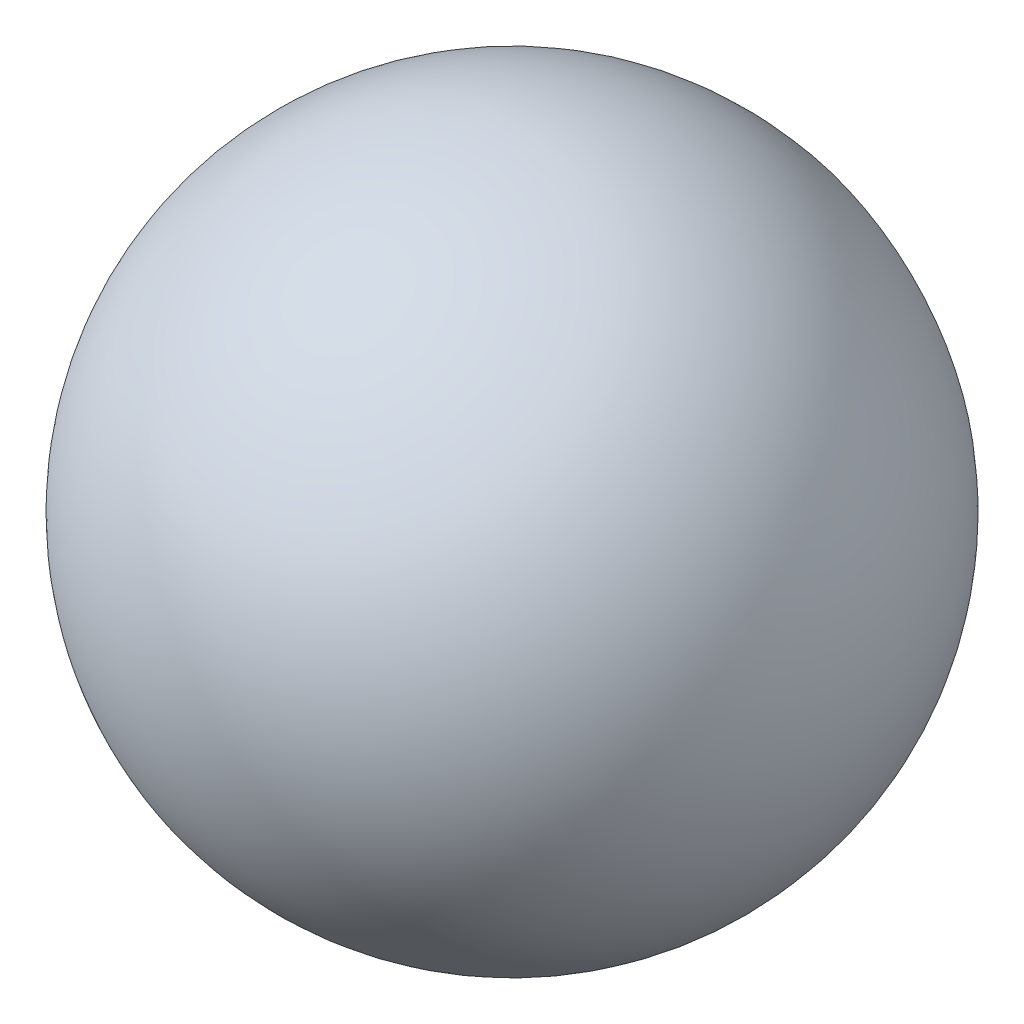
ISO-10303-21;
HEADER;
FILE_DESCRIPTION(('STEP AP214'),'2;1');
FILE_NAME('part.step','',(''),(''),'','','');
FILE_SCHEMA(('AUTOMOTIVE_DESIGN { 1 0 10303 214 1 1 1 1 }'));
ENDSEC;
DATA;
#1=APPLICATION_CONTEXT('core data for automotive mechanical design processes');
#2=APPLICATION_PROTOCOL_DEFINITION('international standard','automotive_design',2000,#1);
#3=PRODUCT_CONTEXT('',#1,'mechanical');
#4=PRODUCT('Part','Part','',(#3));
#5=PRODUCT_RELATED_PRODUCT_CATEGORY('part','',(#4));
#6=PRODUCT_DEFINITION_FORMATION('','',#4);
#7=PRODUCT_DEFINITION_CONTEXT('part definition',#1,'design');
#8=PRODUCT_DEFINITION('design','',#6,#7);
#9=PRODUCT_DEFINITION_SHAPE('','',#8);
#10=(LENGTH_UNIT() NAMED_UNIT(*) SI_UNIT(.MILLI.,.METRE.));
#11=(NAMED_UNIT(*) PLANE_ANGLE_UNIT() SI_UNIT($,.RADIAN.));
#12=(NAMED_UNIT(*) SI_UNIT($,.STERADIAN.) SOLID_ANGLE_UNIT());
#13=UNCERTAINTY_MEASURE_WITH_UNIT(LENGTH_MEASURE(1.E-05),#10,'distance_accuracy_value','');
#14=(GEOMETRIC_REPRESENTATION_CONTEXT(3) GLOBAL_UNCERTAINTY_ASSIGNED_CONTEXT((#13)) GLOBAL_UNIT_ASSIGNED_CONTEXT((#10,
#11,#12)) REPRESENTATION_CONTEXT('',''));
#15=CARTESIAN_POINT('',(0.,0.,0.));
#16=DIRECTION('',(0.,0.,1.));
#17=DIRECTION('',(1.,0.,0.));
#18=AXIS2_PLACEMENT_3D('',#15,#16,#17);
#19=CARTESIAN_POINT('',(0.,0.,0.));
#20=DIRECTION('',(0.,0.,-1.));
#21=DIRECTION('',(1.,0.,0.));
#22=AXIS2_PLACEMENT_3D('',#19,#20,#21);
#23=SPHERICAL_SURFACE('',#22,27.5);
#24=CARTESIAN_POINT('',(0.,0.,-21.1148094994454));
#25=DIRECTION('',(0.,0.,-1.));
#26=DIRECTION('',(-1.,0.,0.));
#27=AXIS2_PLACEMENT_3D('',#24,#25,#26);
#28=CIRCLE('',#27,17.6185930142599);
#29=CARTESIAN_POINT('',(-17.6185930142599,0.,-21.1148094994454));
#30=VERTEX_POINT('',#29);
#31=EDGE_CURVE('E10',#30,#30,#28,.T.);
#32=ORIENTED_EDGE('',*,*,#31,.F.);
#33=EDGE_LOOP('',(#32));
#34=FACE_BOUND('',#33,.T.);
#35=ADVANCED_FACE('F39',(#34),#23,.T.);
#36=CARTESIAN_POINT('',(0.,0.,-21.1148094994454));
#37=DIRECTION('',(0.,0.,1.));
#38=DIRECTION('',(1.,0.,0.));
#39=AXIS2_PLACEMENT_3D('',#36,#37,#38);
#40=PLANE('',#39);
#41=ORIENTED_EDGE('',*,*,#31,.T.);
#42=EDGE_LOOP('',(#41));
#43=FACE_BOUND('',#42,.T.);
#44=ADVANCED_FACE('F46',(#43),#40,.F.);
#45=CLOSED_SHELL('',(#35,#44));
#46=MANIFOLD_SOLID_BREP('B2',#45);
#47=ADVANCED_BREP_SHAPE_REPRESENTATION('',(#18,#46),#14);
#48=SHAPE_DEFINITION_REPRESENTATION(#9,#47);
ENDSEC;
END-ISO-10303-21;
